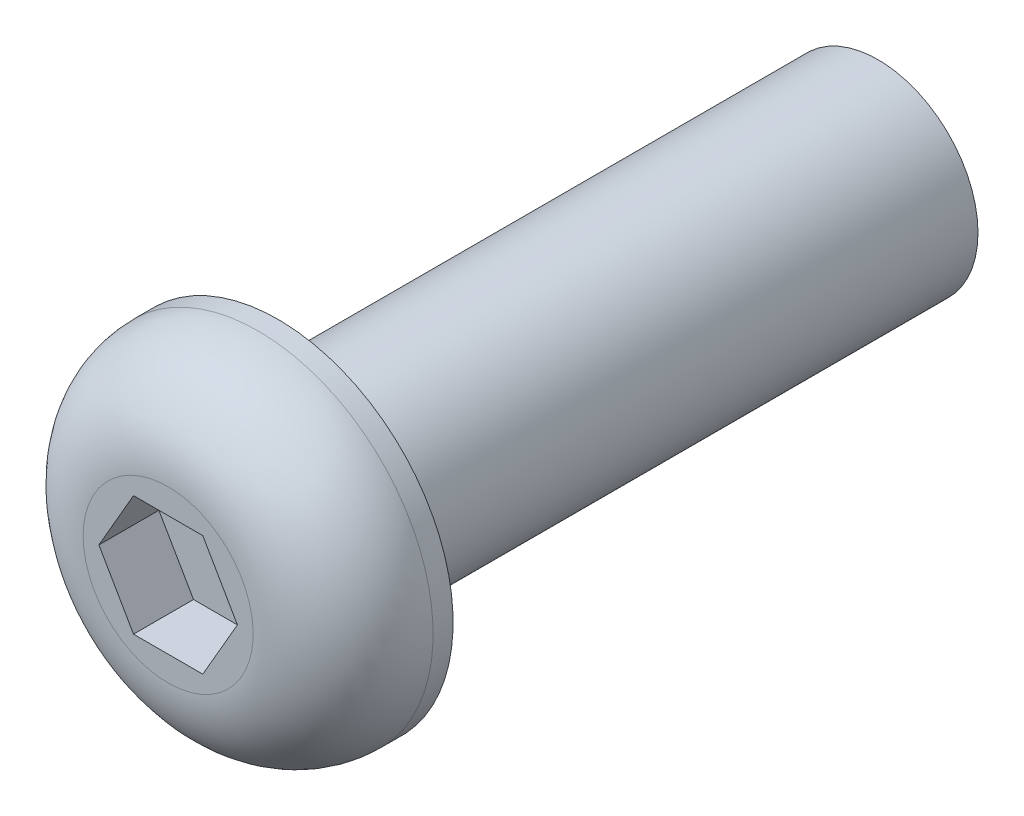
ISO-10303-21;
HEADER;
FILE_DESCRIPTION(('STEP AP214'),'2;1');
FILE_NAME('part.step','',(''),(''),'','','');
FILE_SCHEMA(('AUTOMOTIVE_DESIGN { 1 0 10303 214 1 1 1 1 }'));
ENDSEC;
DATA;
#1=APPLICATION_CONTEXT('core data for automotive mechanical design processes');
#2=APPLICATION_PROTOCOL_DEFINITION('international standard','automotive_design',2000,#1);
#3=PRODUCT_CONTEXT('',#1,'mechanical');
#4=PRODUCT('Part','Part','',(#3));
#5=PRODUCT_RELATED_PRODUCT_CATEGORY('part','',(#4));
#6=PRODUCT_DEFINITION_FORMATION('','',#4);
#7=PRODUCT_DEFINITION_CONTEXT('part definition',#1,'design');
#8=PRODUCT_DEFINITION('design','',#6,#7);
#9=PRODUCT_DEFINITION_SHAPE('','',#8);
#10=(LENGTH_UNIT() NAMED_UNIT(*) SI_UNIT(.MILLI.,.METRE.));
#11=(NAMED_UNIT(*) PLANE_ANGLE_UNIT() SI_UNIT($,.RADIAN.));
#12=(NAMED_UNIT(*) SI_UNIT($,.STERADIAN.) SOLID_ANGLE_UNIT());
#13=UNCERTAINTY_MEASURE_WITH_UNIT(LENGTH_MEASURE(1.E-05),#10,'distance_accuracy_value','');
#14=(GEOMETRIC_REPRESENTATION_CONTEXT(3) GLOBAL_UNCERTAINTY_ASSIGNED_CONTEXT((#13)) GLOBAL_UNIT_ASSIGNED_CONTEXT((#10,
#11,#12)) REPRESENTATION_CONTEXT('',''));
#15=CARTESIAN_POINT('',(0.,0.,0.));
#16=DIRECTION('',(0.,0.,1.));
#17=DIRECTION('',(1.,0.,0.));
#18=AXIS2_PLACEMENT_3D('',#15,#16,#17);
#19=CARTESIAN_POINT('',(0.,0.,-30.));
#20=DIRECTION('',(0.,0.,1.));
#21=DIRECTION('',(1.,0.,0.));
#22=AXIS2_PLACEMENT_3D('',#19,#20,#21);
#23=CYLINDRICAL_SURFACE('',#22,5.);
#24=CARTESIAN_POINT('',(0.,0.,-30.));
#25=DIRECTION('',(0.,0.,1.));
#26=DIRECTION('',(1.,0.,0.));
#27=AXIS2_PLACEMENT_3D('',#24,#25,#26);
#28=CIRCLE('',#27,5.);
#29=CARTESIAN_POINT('',(5.,0.,-30.));
#30=VERTEX_POINT('',#29);
#31=EDGE_CURVE('E11',#30,#30,#28,.T.);
#32=ORIENTED_EDGE('',*,*,#31,.T.);
#33=EDGE_LOOP('',(#32));
#34=FACE_BOUND('',#33,.T.);
#35=CARTESIAN_POINT('',(0.,0.,0.));
#36=DIRECTION('',(0.,0.,1.));
#37=DIRECTION('',(1.,0.,0.));
#38=AXIS2_PLACEMENT_3D('',#35,#36,#37);
#39=CIRCLE('',#38,5.);
#40=CARTESIAN_POINT('',(5.,0.,0.));
#41=VERTEX_POINT('',#40);
#42=EDGE_CURVE('E40',#41,#41,#39,.T.);
#43=ORIENTED_EDGE('',*,*,#42,.F.);
#44=EDGE_LOOP('',(#43));
#45=FACE_BOUND('',#44,.T.);
#46=ADVANCED_FACE('F37',(#34,#45),#23,.T.);
#47=CARTESIAN_POINT('',(0.,0.,-30.));
#48=DIRECTION('',(0.,0.,1.));
#49=DIRECTION('',(1.,0.,0.));
#50=AXIS2_PLACEMENT_3D('',#47,#48,#49);
#51=PLANE('',#50);
#52=ORIENTED_EDGE('',*,*,#31,.F.);
#53=EDGE_LOOP('',(#52));
#54=FACE_BOUND('',#53,.T.);
#55=ADVANCED_FACE('F160',(#54),#51,.F.);
#56=CARTESIAN_POINT('',(0.,0.,5.5));
#57=DIRECTION('',(0.,0.,1.));
#58=DIRECTION('',(1.,0.,0.));
#59=AXIS2_PLACEMENT_3D('',#56,#57,#58);
#60=PLANE('',#59);
#61=DIRECTION('',(-1.,0.,0.));
#62=VECTOR('',#61,1.);
#63=CARTESIAN_POINT('',(1.73205080756888,3.,5.5));
#64=LINE('',#63,#62);
#65=CARTESIAN_POINT('',(1.73205080756888,3.,5.5));
#66=VERTEX_POINT('',#65);
#67=CARTESIAN_POINT('',(-1.73205080756888,3.,5.5));
#68=VERTEX_POINT('',#67);
#69=EDGE_CURVE('E51',#66,#68,#64,.T.);
#70=ORIENTED_EDGE('',*,*,#69,.F.);
#71=DIRECTION('',(-0.5,0.866025403784439,0.));
#72=VECTOR('',#71,1.);
#73=CARTESIAN_POINT('',(3.46410161513775,0.,5.5));
#74=LINE('',#73,#72);
#75=CARTESIAN_POINT('',(3.46410161513775,0.,5.5));
#76=VERTEX_POINT('',#75);
#77=EDGE_CURVE('E134',#76,#66,#74,.T.);
#78=ORIENTED_EDGE('',*,*,#77,.F.);
#79=DIRECTION('',(0.5,0.866025403784439,0.));
#80=VECTOR('',#79,1.);
#81=CARTESIAN_POINT('',(1.73205080756888,-3.,5.5));
#82=LINE('',#81,#80);
#83=CARTESIAN_POINT('',(1.73205080756888,-3.,5.5));
#84=VERTEX_POINT('',#83);
#85=EDGE_CURVE('E132',#84,#76,#82,.T.);
#86=ORIENTED_EDGE('',*,*,#85,.F.);
#87=DIRECTION('',(1.,0.,0.));
#88=VECTOR('',#87,1.);
#89=CARTESIAN_POINT('',(-1.73205080756888,-3.,5.5));
#90=LINE('',#89,#88);
#91=CARTESIAN_POINT('',(-1.73205080756888,-3.,5.5));
#92=VERTEX_POINT('',#91);
#93=EDGE_CURVE('E99',#92,#84,#90,.T.);
#94=ORIENTED_EDGE('',*,*,#93,.F.);
#95=DIRECTION('',(0.5,-0.866025403784439,0.));
#96=VECTOR('',#95,1.);
#97=CARTESIAN_POINT('',(-3.46410161513775,0.,5.5));
#98=LINE('',#97,#96);
#99=CARTESIAN_POINT('',(-3.46410161513775,0.,5.5));
#100=VERTEX_POINT('',#99);
#101=EDGE_CURVE('E128',#100,#92,#98,.T.);
#102=ORIENTED_EDGE('',*,*,#101,.F.);
#103=DIRECTION('',(-0.5,-0.866025403784438,0.));
#104=VECTOR('',#103,1.);
#105=CARTESIAN_POINT('',(-1.73205080756888,3.,5.5));
#106=LINE('',#105,#104);
#107=EDGE_CURVE('E125',#68,#100,#106,.T.);
#108=ORIENTED_EDGE('',*,*,#107,.F.);
#109=EDGE_LOOP('',(#70,#78,#86,#94,#102,#108));
#110=FACE_BOUND('',#109,.T.);
#111=CARTESIAN_POINT('',(0.,0.,5.5));
#112=DIRECTION('',(0.,0.,-1.));
#113=DIRECTION('',(-1.,0.,0.));
#114=AXIS2_PLACEMENT_3D('',#111,#112,#113);
#115=CIRCLE('',#114,4.25);
#116=CARTESIAN_POINT('',(-4.25,0.,5.5));
#117=VERTEX_POINT('',#116);
#118=EDGE_CURVE('E149',#117,#117,#115,.T.);
#119=ORIENTED_EDGE('',*,*,#118,.F.);
#120=EDGE_LOOP('',(#119));
#121=FACE_BOUND('',#120,.T.);
#122=ADVANCED_FACE('F165',(#110,#121),#60,.T.);
#123=CARTESIAN_POINT('',(0.,0.,0.999999999999999));
#124=DIRECTION('',(0.,0.,-1.));
#125=DIRECTION('',(-1.,0.,0.));
#126=AXIS2_PLACEMENT_3D('',#123,#124,#125);
#127=DEGENERATE_TOROIDAL_SURFACE('',#126,4.25,4.5,.T.);
#128=ORIENTED_EDGE('',*,*,#118,.T.);
#129=EDGE_LOOP('',(#128));
#130=FACE_BOUND('',#129,.T.);
#131=CARTESIAN_POINT('',(0.,0.,1.));
#132=DIRECTION('',(0.,0.,-1.));
#133=DIRECTION('',(-1.,0.,0.));
#134=AXIS2_PLACEMENT_3D('',#131,#132,#133);
#135=CIRCLE('',#134,8.75);
#136=CARTESIAN_POINT('',(-8.75,0.,1.));
#137=VERTEX_POINT('',#136);
#138=EDGE_CURVE('E146',#137,#137,#135,.T.);
#139=ORIENTED_EDGE('',*,*,#138,.F.);
#140=EDGE_LOOP('',(#139));
#141=FACE_BOUND('',#140,.T.);
#142=ADVANCED_FACE('F171',(#130,#141),#127,.T.);
#143=CARTESIAN_POINT('',(0.,0.,0.));
#144=DIRECTION('',(0.,0.,-1.));
#145=DIRECTION('',(-1.,0.,0.));
#146=AXIS2_PLACEMENT_3D('',#143,#144,#145);
#147=CYLINDRICAL_SURFACE('',#146,8.75);
#148=ORIENTED_EDGE('',*,*,#138,.T.);
#149=EDGE_LOOP('',(#148));
#150=FACE_BOUND('',#149,.T.);
#151=CARTESIAN_POINT('',(0.,0.,0.));
#152=DIRECTION('',(0.,0.,-1.));
#153=DIRECTION('',(-1.,0.,0.));
#154=AXIS2_PLACEMENT_3D('',#151,#152,#153);
#155=CIRCLE('',#154,8.75);
#156=CARTESIAN_POINT('',(-8.75,0.,0.));
#157=VERTEX_POINT('',#156);
#158=EDGE_CURVE('E138',#157,#157,#155,.T.);
#159=ORIENTED_EDGE('',*,*,#158,.F.);
#160=EDGE_LOOP('',(#159));
#161=FACE_BOUND('',#160,.T.);
#162=ADVANCED_FACE('F177',(#150,#161),#147,.T.);
#163=CARTESIAN_POINT('',(0.,0.,0.));
#164=DIRECTION('',(0.,0.,-1.));
#165=DIRECTION('',(-1.,0.,0.));
#166=AXIS2_PLACEMENT_3D('',#163,#164,#165);
#167=PLANE('',#166);
#168=ORIENTED_EDGE('',*,*,#42,.T.);
#169=EDGE_LOOP('',(#168));
#170=FACE_BOUND('',#169,.T.);
#171=ORIENTED_EDGE('',*,*,#158,.T.);
#172=EDGE_LOOP('',(#171));
#173=FACE_BOUND('',#172,.T.);
#174=ADVANCED_FACE('F156',(#170,#173),#167,.T.);
#175=CARTESIAN_POINT('',(1.73205080756888,3.,2.5));
#176=DIRECTION('',(0.,1.,0.));
#177=DIRECTION('',(0.,0.,1.));
#178=AXIS2_PLACEMENT_3D('',#175,#176,#177);
#179=PLANE('',#178);
#180=ORIENTED_EDGE('',*,*,#69,.T.);
#181=DIRECTION('',(0.,0.,1.));
#182=VECTOR('',#181,1.);
#183=CARTESIAN_POINT('',(-1.73205080756888,3.,2.5));
#184=LINE('',#183,#182);
#185=CARTESIAN_POINT('',(-1.73205080756888,3.,2.5));
#186=VERTEX_POINT('',#185);
#187=EDGE_CURVE('E81',#186,#68,#184,.T.);
#188=ORIENTED_EDGE('',*,*,#187,.F.);
#189=DIRECTION('',(-1.,0.,0.));
#190=VECTOR('',#189,1.);
#191=CARTESIAN_POINT('',(1.73205080756888,3.,2.5));
#192=LINE('',#191,#190);
#193=CARTESIAN_POINT('',(1.73205080756888,3.,2.5));
#194=VERTEX_POINT('',#193);
#195=EDGE_CURVE('E136',#194,#186,#192,.T.);
#196=ORIENTED_EDGE('',*,*,#195,.F.);
#197=DIRECTION('',(0.,0.,1.));
#198=VECTOR('',#197,1.);
#199=CARTESIAN_POINT('',(1.73205080756888,3.,2.5));
#200=LINE('',#199,#198);
#201=EDGE_CURVE('E59',#194,#66,#200,.T.);
#202=ORIENTED_EDGE('',*,*,#201,.T.);
#203=EDGE_LOOP('',(#180,#188,#196,#202));
#204=FACE_BOUND('',#203,.T.);
#205=ADVANCED_FACE('F183',(#204),#179,.F.);
#206=CARTESIAN_POINT('',(3.46410161513775,0.,2.5));
#207=DIRECTION('',(0.866025403784439,0.5,0.));
#208=DIRECTION('',(-0.5,0.866025403784439,0.));
#209=AXIS2_PLACEMENT_3D('',#206,#207,#208);
#210=PLANE('',#209);
#211=ORIENTED_EDGE('',*,*,#77,.T.);
#212=ORIENTED_EDGE('',*,*,#201,.F.);
#213=DIRECTION('',(-0.5,0.866025403784439,0.));
#214=VECTOR('',#213,1.);
#215=CARTESIAN_POINT('',(3.46410161513775,0.,2.5));
#216=LINE('',#215,#214);
#217=CARTESIAN_POINT('',(3.46410161513775,0.,2.5));
#218=VERTEX_POINT('',#217);
#219=EDGE_CURVE('E111',#218,#194,#216,.T.);
#220=ORIENTED_EDGE('',*,*,#219,.F.);
#221=DIRECTION('',(0.,0.,1.));
#222=VECTOR('',#221,1.);
#223=CARTESIAN_POINT('',(3.46410161513775,0.,2.5));
#224=LINE('',#223,#222);
#225=EDGE_CURVE('E103',#218,#76,#224,.T.);
#226=ORIENTED_EDGE('',*,*,#225,.T.);
#227=EDGE_LOOP('',(#211,#212,#220,#226));
#228=FACE_BOUND('',#227,.T.);
#229=ADVANCED_FACE('F186',(#228),#210,.F.);
#230=CARTESIAN_POINT('',(1.73205080756888,-3.,2.5));
#231=DIRECTION('',(0.866025403784439,-0.5,0.));
#232=DIRECTION('',(0.5,0.866025403784439,0.));
#233=AXIS2_PLACEMENT_3D('',#230,#231,#232);
#234=PLANE('',#233);
#235=ORIENTED_EDGE('',*,*,#85,.T.);
#236=ORIENTED_EDGE('',*,*,#225,.F.);
#237=DIRECTION('',(0.5,0.866025403784439,0.));
#238=VECTOR('',#237,1.);
#239=CARTESIAN_POINT('',(1.73205080756888,-3.,2.5));
#240=LINE('',#239,#238);
#241=CARTESIAN_POINT('',(1.73205080756888,-3.,2.5));
#242=VERTEX_POINT('',#241);
#243=EDGE_CURVE('E107',#242,#218,#240,.T.);
#244=ORIENTED_EDGE('',*,*,#243,.F.);
#245=DIRECTION('',(0.,0.,1.));
#246=VECTOR('',#245,1.);
#247=CARTESIAN_POINT('',(1.73205080756888,-3.,2.5));
#248=LINE('',#247,#246);
#249=EDGE_CURVE('E92',#242,#84,#248,.T.);
#250=ORIENTED_EDGE('',*,*,#249,.T.);
#251=EDGE_LOOP('',(#235,#236,#244,#250));
#252=FACE_BOUND('',#251,.T.);
#253=ADVANCED_FACE('F108',(#252),#234,.F.);
#254=CARTESIAN_POINT('',(-1.73205080756888,-3.,2.5));
#255=DIRECTION('',(0.,-1.,0.));
#256=DIRECTION('',(0.,0.,-1.));
#257=AXIS2_PLACEMENT_3D('',#254,#255,#256);
#258=PLANE('',#257);
#259=ORIENTED_EDGE('',*,*,#93,.T.);
#260=ORIENTED_EDGE('',*,*,#249,.F.);
#261=DIRECTION('',(1.,0.,0.));
#262=VECTOR('',#261,1.);
#263=CARTESIAN_POINT('',(-1.73205080756888,-3.,2.5));
#264=LINE('',#263,#262);
#265=CARTESIAN_POINT('',(-1.73205080756888,-3.,2.5));
#266=VERTEX_POINT('',#265);
#267=EDGE_CURVE('E96',#266,#242,#264,.T.);
#268=ORIENTED_EDGE('',*,*,#267,.F.);
#269=DIRECTION('',(0.,0.,1.));
#270=VECTOR('',#269,1.);
#271=CARTESIAN_POINT('',(-1.73205080756888,-3.,2.5));
#272=LINE('',#271,#270);
#273=EDGE_CURVE('E104',#266,#92,#272,.T.);
#274=ORIENTED_EDGE('',*,*,#273,.T.);
#275=EDGE_LOOP('',(#259,#260,#268,#274));
#276=FACE_BOUND('',#275,.T.);
#277=ADVANCED_FACE('F94',(#276),#258,.F.);
#278=CARTESIAN_POINT('',(-3.46410161513775,0.,2.5));
#279=DIRECTION('',(-0.866025403784439,-0.5,0.));
#280=DIRECTION('',(0.5,-0.866025403784439,0.));
#281=AXIS2_PLACEMENT_3D('',#278,#279,#280);
#282=PLANE('',#281);
#283=ORIENTED_EDGE('',*,*,#101,.T.);
#284=ORIENTED_EDGE('',*,*,#273,.F.);
#285=DIRECTION('',(0.5,-0.866025403784439,0.));
#286=VECTOR('',#285,1.);
#287=CARTESIAN_POINT('',(-3.46410161513775,0.,2.5));
#288=LINE('',#287,#286);
#289=CARTESIAN_POINT('',(-3.46410161513775,0.,2.5));
#290=VERTEX_POINT('',#289);
#291=EDGE_CURVE('E117',#290,#266,#288,.T.);
#292=ORIENTED_EDGE('',*,*,#291,.F.);
#293=DIRECTION('',(0.,0.,1.));
#294=VECTOR('',#293,1.);
#295=CARTESIAN_POINT('',(-3.46410161513775,0.,2.5));
#296=LINE('',#295,#294);
#297=EDGE_CURVE('E141',#290,#100,#296,.T.);
#298=ORIENTED_EDGE('',*,*,#297,.T.);
#299=EDGE_LOOP('',(#283,#284,#292,#298));
#300=FACE_BOUND('',#299,.T.);
#301=ADVANCED_FACE('F190',(#300),#282,.F.);
#302=CARTESIAN_POINT('',(-1.73205080756888,3.,2.5));
#303=DIRECTION('',(-0.866025403784439,0.5,0.));
#304=DIRECTION('',(-0.5,-0.866025403784439,0.));
#305=AXIS2_PLACEMENT_3D('',#302,#303,#304);
#306=PLANE('',#305);
#307=ORIENTED_EDGE('',*,*,#107,.T.);
#308=ORIENTED_EDGE('',*,*,#297,.F.);
#309=DIRECTION('',(-0.5,-0.866025403784438,0.));
#310=VECTOR('',#309,1.);
#311=CARTESIAN_POINT('',(-1.73205080756888,3.,2.5));
#312=LINE('',#311,#310);
#313=EDGE_CURVE('E119',#186,#290,#312,.T.);
#314=ORIENTED_EDGE('',*,*,#313,.F.);
#315=ORIENTED_EDGE('',*,*,#187,.T.);
#316=EDGE_LOOP('',(#307,#308,#314,#315));
#317=FACE_BOUND('',#316,.T.);
#318=ADVANCED_FACE('F187',(#317),#306,.F.);
#319=CARTESIAN_POINT('',(-5.19615242270663,3.,2.5));
#320=DIRECTION('',(0.,0.,1.));
#321=DIRECTION('',(1.,0.,0.));
#322=AXIS2_PLACEMENT_3D('',#319,#320,#321);
#323=PLANE('',#322);
#324=ORIENTED_EDGE('',*,*,#195,.T.);
#325=ORIENTED_EDGE('',*,*,#313,.T.);
#326=ORIENTED_EDGE('',*,*,#291,.T.);
#327=ORIENTED_EDGE('',*,*,#267,.T.);
#328=ORIENTED_EDGE('',*,*,#243,.T.);
#329=ORIENTED_EDGE('',*,*,#219,.T.);
#330=EDGE_LOOP('',(#324,#325,#326,#327,#328,#329));
#331=FACE_BOUND('',#330,.T.);
#332=ADVANCED_FACE('F114',(#331),#323,.T.);
#333=CLOSED_SHELL('',(#46,#55,#122,#142,#162,#174,#205,#229,#253,#277,#301,#318,#332));
#334=MANIFOLD_SOLID_BREP('B2',#333);
#335=ADVANCED_BREP_SHAPE_REPRESENTATION('',(#18,#334),#14);
#336=SHAPE_DEFINITION_REPRESENTATION(#9,#335);
ENDSEC;
END-ISO-10303-21;
